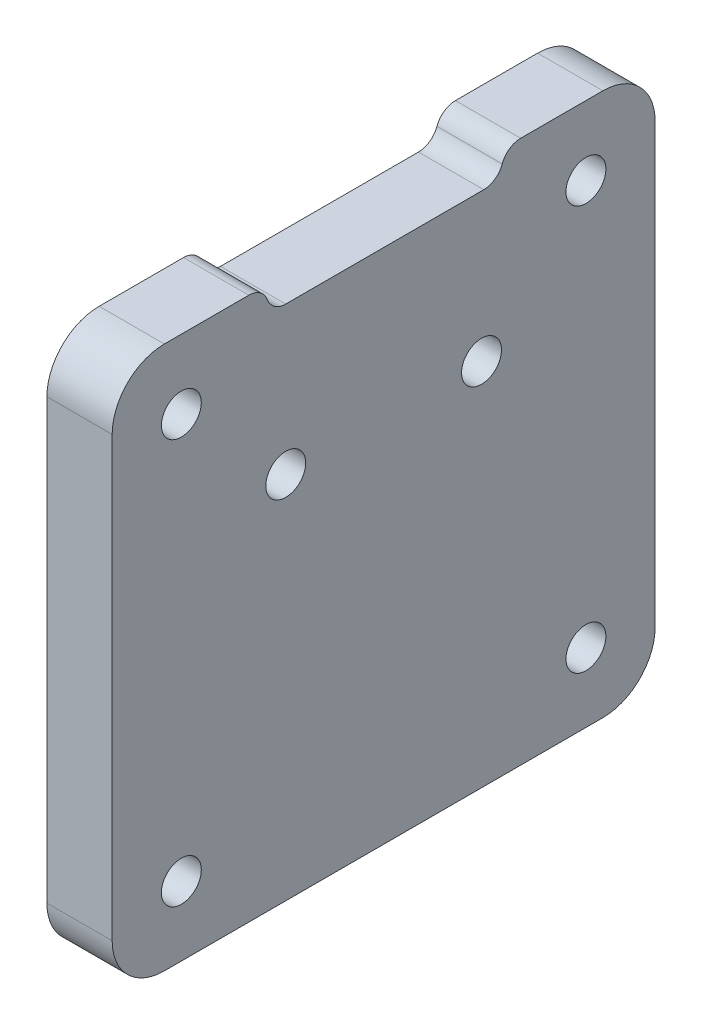
ISO-10303-21;
HEADER;
FILE_DESCRIPTION(('STEP AP214'),'2;1');
FILE_NAME('part.step','',(''),(''),'','','');
FILE_SCHEMA(('AUTOMOTIVE_DESIGN { 1 0 10303 214 1 1 1 1 }'));
ENDSEC;
DATA;
#1=APPLICATION_CONTEXT('core data for automotive mechanical design processes');
#2=APPLICATION_PROTOCOL_DEFINITION('international standard','automotive_design',2000,#1);
#3=PRODUCT_CONTEXT('',#1,'mechanical');
#4=PRODUCT('Part','Part','',(#3));
#5=PRODUCT_RELATED_PRODUCT_CATEGORY('part','',(#4));
#6=PRODUCT_DEFINITION_FORMATION('','',#4);
#7=PRODUCT_DEFINITION_CONTEXT('part definition',#1,'design');
#8=PRODUCT_DEFINITION('design','',#6,#7);
#9=PRODUCT_DEFINITION_SHAPE('','',#8);
#10=(LENGTH_UNIT() NAMED_UNIT(*) SI_UNIT(.MILLI.,.METRE.));
#11=(NAMED_UNIT(*) PLANE_ANGLE_UNIT() SI_UNIT($,.RADIAN.));
#12=(NAMED_UNIT(*) SI_UNIT($,.STERADIAN.) SOLID_ANGLE_UNIT());
#13=UNCERTAINTY_MEASURE_WITH_UNIT(LENGTH_MEASURE(1.E-05),#10,'distance_accuracy_value','');
#14=(GEOMETRIC_REPRESENTATION_CONTEXT(3) GLOBAL_UNCERTAINTY_ASSIGNED_CONTEXT((#13)) GLOBAL_UNIT_ASSIGNED_CONTEXT((#10,
#11,#12)) REPRESENTATION_CONTEXT('',''));
#15=CARTESIAN_POINT('',(0.,0.,0.));
#16=DIRECTION('',(0.,0.,1.));
#17=DIRECTION('',(1.,0.,0.));
#18=AXIS2_PLACEMENT_3D('',#15,#16,#17);
#19=CARTESIAN_POINT('',(5.,0.,0.));
#20=DIRECTION('',(1.,0.,0.));
#21=DIRECTION('',(0.,1.,0.));
#22=AXIS2_PLACEMENT_3D('',#19,#20,#21);
#23=PLANE('',#22);
#24=CARTESIAN_POINT('',(5.,7.5,7.5));
#25=DIRECTION('',(-1.,0.,0.));
#26=DIRECTION('',(0.,1.,0.));
#27=AXIS2_PLACEMENT_3D('',#24,#25,#26);
#28=CIRCLE('',#27,1.53);
#29=CARTESIAN_POINT('',(5.,5.97,7.5));
#30=VERTEX_POINT('',#29);
#31=EDGE_CURVE('E280',#30,#30,#28,.T.);
#32=ORIENTED_EDGE('',*,*,#31,.T.);
#33=EDGE_LOOP('',(#32));
#34=FACE_BOUND('',#33,.T.);
#35=CARTESIAN_POINT('',(5.,7.5,-7.5));
#36=DIRECTION('',(-1.,0.,0.));
#37=DIRECTION('',(0.,1.,0.));
#38=AXIS2_PLACEMENT_3D('',#35,#36,#37);
#39=CIRCLE('',#38,1.53);
#40=CARTESIAN_POINT('',(5.,5.97,-7.5));
#41=VERTEX_POINT('',#40);
#42=EDGE_CURVE('E279',#41,#41,#39,.T.);
#43=ORIENTED_EDGE('',*,*,#42,.T.);
#44=EDGE_LOOP('',(#43));
#45=FACE_BOUND('',#44,.T.);
#46=CARTESIAN_POINT('',(5.,15.5,-15.5));
#47=DIRECTION('',(-1.,0.,0.));
#48=DIRECTION('',(0.,1.,0.));
#49=AXIS2_PLACEMENT_3D('',#46,#47,#48);
#50=CIRCLE('',#49,1.53);
#51=CARTESIAN_POINT('',(5.,13.97,-15.5));
#52=VERTEX_POINT('',#51);
#53=EDGE_CURVE('E367',#52,#52,#50,.T.);
#54=ORIENTED_EDGE('',*,*,#53,.T.);
#55=EDGE_LOOP('',(#54));
#56=FACE_BOUND('',#55,.T.);
#57=CARTESIAN_POINT('',(5.,-15.5,-15.5));
#58=DIRECTION('',(-1.,0.,0.));
#59=DIRECTION('',(0.,1.,0.));
#60=AXIS2_PLACEMENT_3D('',#57,#58,#59);
#61=CIRCLE('',#60,1.53);
#62=CARTESIAN_POINT('',(5.,-17.03,-15.5));
#63=VERTEX_POINT('',#62);
#64=EDGE_CURVE('E334',#63,#63,#61,.T.);
#65=ORIENTED_EDGE('',*,*,#64,.T.);
#66=EDGE_LOOP('',(#65));
#67=FACE_BOUND('',#66,.T.);
#68=CARTESIAN_POINT('',(5.,15.5,15.5));
#69=DIRECTION('',(-1.,0.,0.));
#70=DIRECTION('',(0.,1.,0.));
#71=AXIS2_PLACEMENT_3D('',#68,#69,#70);
#72=CIRCLE('',#71,1.53);
#73=CARTESIAN_POINT('',(5.,13.97,15.5));
#74=VERTEX_POINT('',#73);
#75=EDGE_CURVE('E302',#74,#74,#72,.T.);
#76=ORIENTED_EDGE('',*,*,#75,.T.);
#77=EDGE_LOOP('',(#76));
#78=FACE_BOUND('',#77,.T.);
#79=CARTESIAN_POINT('',(5.,-15.5,15.5));
#80=DIRECTION('',(-1.,0.,0.));
#81=DIRECTION('',(0.,1.,0.));
#82=AXIS2_PLACEMENT_3D('',#79,#80,#81);
#83=CIRCLE('',#82,1.53);
#84=CARTESIAN_POINT('',(5.,-17.03,15.5));
#85=VERTEX_POINT('',#84);
#86=EDGE_CURVE('E39',#85,#85,#83,.T.);
#87=ORIENTED_EDGE('',*,*,#86,.T.);
#88=EDGE_LOOP('',(#87));
#89=FACE_BOUND('',#88,.T.);
#90=CARTESIAN_POINT('',(5.,16.8,-16.8));
#91=DIRECTION('',(-1.,0.,0.));
#92=DIRECTION('',(0.,0.707106781186548,-0.707106781186548));
#93=AXIS2_PLACEMENT_3D('',#90,#91,#92);
#94=CIRCLE('',#93,4.);
#95=CARTESIAN_POINT('',(5.,20.8,-16.8));
#96=VERTEX_POINT('',#95);
#97=CARTESIAN_POINT('',(5.,16.8,-20.8));
#98=VERTEX_POINT('',#97);
#99=EDGE_CURVE('E264',#96,#98,#94,.T.);
#100=ORIENTED_EDGE('',*,*,#99,.F.);
#101=DIRECTION('',(0.,0.,1.));
#102=VECTOR('',#101,1.);
#103=CARTESIAN_POINT('',(5.,20.8,-20.8));
#104=LINE('',#103,#102);
#105=CARTESIAN_POINT('',(5.,20.8,-10.5));
#106=VERTEX_POINT('',#105);
#107=EDGE_CURVE('E373',#96,#106,#104,.T.);
#108=ORIENTED_EDGE('',*,*,#107,.T.);
#109=CARTESIAN_POINT('',(5.,19.3,-10.5));
#110=DIRECTION('',(-1.,0.,0.));
#111=DIRECTION('',(0.,0.707106781186548,0.707106781186548));
#112=AXIS2_PLACEMENT_3D('',#109,#110,#111);
#113=CIRCLE('',#112,1.5);
#114=CARTESIAN_POINT('',(5.,19.8,-9.08578643762691));
#115=VERTEX_POINT('',#114);
#116=EDGE_CURVE('E271',#115,#106,#113,.T.);
#117=ORIENTED_EDGE('',*,*,#116,.F.);
#118=CARTESIAN_POINT('',(5.,20.3,-7.67157287525381));
#119=DIRECTION('',(1.,0.,0.));
#120=DIRECTION('',(0.,1.,0.));
#121=AXIS2_PLACEMENT_3D('',#118,#119,#120);
#122=CIRCLE('',#121,1.5);
#123=CARTESIAN_POINT('',(5.,18.8,-7.67157287525381));
#124=VERTEX_POINT('',#123);
#125=EDGE_CURVE('E436',#124,#115,#122,.T.);
#126=ORIENTED_EDGE('',*,*,#125,.F.);
#127=DIRECTION('',(0.,0.,1.));
#128=VECTOR('',#127,1.);
#129=CARTESIAN_POINT('',(5.,18.8,9.));
#130=LINE('',#129,#128);
#131=CARTESIAN_POINT('',(5.,18.8,7.5));
#132=VERTEX_POINT('',#131);
#133=EDGE_CURVE('E173',#124,#132,#130,.T.);
#134=ORIENTED_EDGE('',*,*,#133,.T.);
#135=CARTESIAN_POINT('',(5.,20.3,7.5));
#136=DIRECTION('',(1.,0.,0.));
#137=DIRECTION('',(0.,-0.707106781186549,0.707106781186546));
#138=AXIS2_PLACEMENT_3D('',#135,#136,#137);
#139=CIRCLE('',#138,1.5);
#140=CARTESIAN_POINT('',(5.,19.8,8.91421356237309));
#141=VERTEX_POINT('',#140);
#142=EDGE_CURVE('E258',#141,#132,#139,.T.);
#143=ORIENTED_EDGE('',*,*,#142,.F.);
#144=CARTESIAN_POINT('',(5.,19.3,10.3284271247462));
#145=DIRECTION('',(-1.,0.,0.));
#146=DIRECTION('',(0.,-1.,0.));
#147=AXIS2_PLACEMENT_3D('',#144,#145,#146);
#148=CIRCLE('',#147,1.5);
#149=CARTESIAN_POINT('',(5.,20.8,10.3284271247462));
#150=VERTEX_POINT('',#149);
#151=EDGE_CURVE('E161',#150,#141,#148,.T.);
#152=ORIENTED_EDGE('',*,*,#151,.F.);
#153=DIRECTION('',(0.,0.,1.));
#154=VECTOR('',#153,1.);
#155=CARTESIAN_POINT('',(5.,20.8,9.));
#156=LINE('',#155,#154);
#157=CARTESIAN_POINT('',(5.,20.8,16.8));
#158=VERTEX_POINT('',#157);
#159=EDGE_CURVE('E154',#150,#158,#156,.T.);
#160=ORIENTED_EDGE('',*,*,#159,.T.);
#161=CARTESIAN_POINT('',(5.,16.8,16.8));
#162=DIRECTION('',(-1.,0.,0.));
#163=DIRECTION('',(0.,0.707106781186548,0.707106781186548));
#164=AXIS2_PLACEMENT_3D('',#161,#162,#163);
#165=CIRCLE('',#164,4.);
#166=CARTESIAN_POINT('',(5.,16.8,20.8));
#167=VERTEX_POINT('',#166);
#168=EDGE_CURVE('E316',#167,#158,#165,.T.);
#169=ORIENTED_EDGE('',*,*,#168,.F.);
#170=DIRECTION('',(0.,-1.,0.));
#171=VECTOR('',#170,1.);
#172=CARTESIAN_POINT('',(5.,20.8,20.8));
#173=LINE('',#172,#171);
#174=CARTESIAN_POINT('',(5.,-16.8,20.8));
#175=VERTEX_POINT('',#174);
#176=EDGE_CURVE('E11',#167,#175,#173,.T.);
#177=ORIENTED_EDGE('',*,*,#176,.T.);
#178=CARTESIAN_POINT('',(5.,-16.8,16.8));
#179=DIRECTION('',(-1.,0.,0.));
#180=DIRECTION('',(0.,-0.707106781186547,0.707106781186548));
#181=AXIS2_PLACEMENT_3D('',#178,#179,#180);
#182=CIRCLE('',#181,4.);
#183=CARTESIAN_POINT('',(5.,-20.8,16.8));
#184=VERTEX_POINT('',#183);
#185=EDGE_CURVE('E215',#184,#175,#182,.T.);
#186=ORIENTED_EDGE('',*,*,#185,.F.);
#187=DIRECTION('',(0.,0.,-1.));
#188=VECTOR('',#187,1.);
#189=CARTESIAN_POINT('',(5.,-20.8,20.8));
#190=LINE('',#189,#188);
#191=CARTESIAN_POINT('',(5.,-20.8,-16.8));
#192=VERTEX_POINT('',#191);
#193=EDGE_CURVE('E220',#184,#192,#190,.T.);
#194=ORIENTED_EDGE('',*,*,#193,.T.);
#195=CARTESIAN_POINT('',(5.,-16.8,-16.8));
#196=DIRECTION('',(-1.,0.,0.));
#197=DIRECTION('',(0.,-0.707106781186548,-0.707106781186547));
#198=AXIS2_PLACEMENT_3D('',#195,#196,#197);
#199=CIRCLE('',#198,4.);
#200=CARTESIAN_POINT('',(5.,-16.8,-20.8));
#201=VERTEX_POINT('',#200);
#202=EDGE_CURVE('E391',#201,#192,#199,.T.);
#203=ORIENTED_EDGE('',*,*,#202,.F.);
#204=DIRECTION('',(0.,1.,0.));
#205=VECTOR('',#204,1.);
#206=CARTESIAN_POINT('',(5.,-20.8,-20.8));
#207=LINE('',#206,#205);
#208=EDGE_CURVE('E27',#201,#98,#207,.T.);
#209=ORIENTED_EDGE('',*,*,#208,.T.);
#210=EDGE_LOOP('',(#100,#108,#117,#126,#134,#143,#152,#160,#169,#177,#186,#194,#203,#209));
#211=FACE_BOUND('',#210,.T.);
#212=ADVANCED_FACE('F16',(#34,#45,#56,#67,#78,#89,#211),#23,.T.);
#213=CARTESIAN_POINT('',(0.,20.8,20.8));
#214=DIRECTION('',(0.,0.,1.));
#215=DIRECTION('',(1.,0.,0.));
#216=AXIS2_PLACEMENT_3D('',#213,#214,#215);
#217=PLANE('',#216);
#218=DIRECTION('',(-1.,0.,0.));
#219=VECTOR('',#218,1.);
#220=CARTESIAN_POINT('',(0.,-16.8,20.8));
#221=LINE('',#220,#219);
#222=CARTESIAN_POINT('',(0.,-16.8,20.8));
#223=VERTEX_POINT('',#222);
#224=EDGE_CURVE('E225',#175,#223,#221,.T.);
#225=ORIENTED_EDGE('',*,*,#224,.F.);
#226=ORIENTED_EDGE('',*,*,#176,.F.);
#227=DIRECTION('',(1.,0.,0.));
#228=VECTOR('',#227,1.);
#229=CARTESIAN_POINT('',(0.,16.8,20.8));
#230=LINE('',#229,#228);
#231=CARTESIAN_POINT('',(0.,16.8,20.8));
#232=VERTEX_POINT('',#231);
#233=EDGE_CURVE('E315',#232,#167,#230,.T.);
#234=ORIENTED_EDGE('',*,*,#233,.F.);
#235=DIRECTION('',(0.,-1.,0.));
#236=VECTOR('',#235,1.);
#237=CARTESIAN_POINT('',(0.,20.8,20.8));
#238=LINE('',#237,#236);
#239=EDGE_CURVE('E286',#232,#223,#238,.T.);
#240=ORIENTED_EDGE('',*,*,#239,.T.);
#241=EDGE_LOOP('',(#225,#226,#234,#240));
#242=FACE_BOUND('',#241,.T.);
#243=ADVANCED_FACE('F544',(#242),#217,.T.);
#244=CARTESIAN_POINT('',(0.,-20.8,-20.8));
#245=DIRECTION('',(0.,0.,-1.));
#246=DIRECTION('',(0.,-1.,0.));
#247=AXIS2_PLACEMENT_3D('',#244,#245,#246);
#248=PLANE('',#247);
#249=DIRECTION('',(-1.,0.,0.));
#250=VECTOR('',#249,1.);
#251=CARTESIAN_POINT('',(0.,16.8,-20.8));
#252=LINE('',#251,#250);
#253=CARTESIAN_POINT('',(0.,16.8,-20.8));
#254=VERTEX_POINT('',#253);
#255=EDGE_CURVE('E259',#98,#254,#252,.T.);
#256=ORIENTED_EDGE('',*,*,#255,.F.);
#257=ORIENTED_EDGE('',*,*,#208,.F.);
#258=DIRECTION('',(1.,0.,0.));
#259=VECTOR('',#258,1.);
#260=CARTESIAN_POINT('',(0.,-16.8,-20.8));
#261=LINE('',#260,#259);
#262=CARTESIAN_POINT('',(0.,-16.8,-20.8));
#263=VERTEX_POINT('',#262);
#264=EDGE_CURVE('E241',#263,#201,#261,.T.);
#265=ORIENTED_EDGE('',*,*,#264,.F.);
#266=DIRECTION('',(0.,1.,0.));
#267=VECTOR('',#266,1.);
#268=CARTESIAN_POINT('',(0.,-20.8,-20.8));
#269=LINE('',#268,#267);
#270=EDGE_CURVE('E377',#263,#254,#269,.T.);
#271=ORIENTED_EDGE('',*,*,#270,.T.);
#272=EDGE_LOOP('',(#256,#257,#265,#271));
#273=FACE_BOUND('',#272,.T.);
#274=ADVANCED_FACE('F501',(#273),#248,.T.);
#275=CARTESIAN_POINT('',(0.,-15.5,15.5));
#276=DIRECTION('',(1.,0.,0.));
#277=DIRECTION('',(0.,1.,0.));
#278=AXIS2_PLACEMENT_3D('',#275,#276,#277);
#279=CYLINDRICAL_SURFACE('',#278,1.53);
#280=CARTESIAN_POINT('',(0.2,-15.5,15.5));
#281=DIRECTION('',(-1.,0.,0.));
#282=DIRECTION('',(0.,1.,0.));
#283=AXIS2_PLACEMENT_3D('',#280,#281,#282);
#284=CIRCLE('',#283,1.53);
#285=CARTESIAN_POINT('',(0.2,-17.03,15.5));
#286=VERTEX_POINT('',#285);
#287=EDGE_CURVE('E342',#286,#286,#284,.T.);
#288=ORIENTED_EDGE('',*,*,#287,.T.);
#289=DIRECTION('',(1.,0.,0.));
#290=VECTOR('',#289,1.);
#291=CARTESIAN_POINT('',(0.,-17.03,15.5));
#292=LINE('',#291,#290);
#293=EDGE_CURVE('E305',#286,#85,#292,.T.);
#294=ORIENTED_EDGE('',*,*,#293,.T.);
#295=ORIENTED_EDGE('',*,*,#86,.F.);
#296=ORIENTED_EDGE('',*,*,#293,.F.);
#297=EDGE_LOOP('',(#288,#294,#295,#296));
#298=FACE_BOUND('',#297,.T.);
#299=ADVANCED_FACE('F1038',(#298),#279,.F.);
#300=CARTESIAN_POINT('',(0.,15.5,15.5));
#301=DIRECTION('',(1.,0.,0.));
#302=DIRECTION('',(0.,1.,0.));
#303=AXIS2_PLACEMENT_3D('',#300,#301,#302);
#304=CYLINDRICAL_SURFACE('',#303,1.53);
#305=CARTESIAN_POINT('',(0.2,15.5,15.5));
#306=DIRECTION('',(-1.,0.,0.));
#307=DIRECTION('',(0.,1.,0.));
#308=AXIS2_PLACEMENT_3D('',#305,#306,#307);
#309=CIRCLE('',#308,1.53);
#310=CARTESIAN_POINT('',(0.2,13.97,15.5));
#311=VERTEX_POINT('',#310);
#312=EDGE_CURVE('E357',#311,#311,#309,.T.);
#313=ORIENTED_EDGE('',*,*,#312,.T.);
#314=DIRECTION('',(1.,0.,0.));
#315=VECTOR('',#314,1.);
#316=CARTESIAN_POINT('',(0.,13.97,15.5));
#317=LINE('',#316,#315);
#318=EDGE_CURVE('E306',#311,#74,#317,.T.);
#319=ORIENTED_EDGE('',*,*,#318,.T.);
#320=ORIENTED_EDGE('',*,*,#75,.F.);
#321=ORIENTED_EDGE('',*,*,#318,.F.);
#322=EDGE_LOOP('',(#313,#319,#320,#321));
#323=FACE_BOUND('',#322,.T.);
#324=ADVANCED_FACE('F551',(#323),#304,.F.);
#325=CARTESIAN_POINT('',(0.,-15.5,-15.5));
#326=DIRECTION('',(1.,0.,0.));
#327=DIRECTION('',(0.,1.,0.));
#328=AXIS2_PLACEMENT_3D('',#325,#326,#327);
#329=CYLINDRICAL_SURFACE('',#328,1.53);
#330=CARTESIAN_POINT('',(0.2,-15.5,-15.5));
#331=DIRECTION('',(-1.,0.,0.));
#332=DIRECTION('',(0.,1.,0.));
#333=AXIS2_PLACEMENT_3D('',#330,#331,#332);
#334=CIRCLE('',#333,1.53);
#335=CARTESIAN_POINT('',(0.2,-17.03,-15.5));
#336=VERTEX_POINT('',#335);
#337=EDGE_CURVE('E329',#336,#336,#334,.T.);
#338=ORIENTED_EDGE('',*,*,#337,.T.);
#339=DIRECTION('',(1.,0.,0.));
#340=VECTOR('',#339,1.);
#341=CARTESIAN_POINT('',(0.,-17.03,-15.5));
#342=LINE('',#341,#340);
#343=EDGE_CURVE('E371',#336,#63,#342,.T.);
#344=ORIENTED_EDGE('',*,*,#343,.T.);
#345=ORIENTED_EDGE('',*,*,#64,.F.);
#346=ORIENTED_EDGE('',*,*,#343,.F.);
#347=EDGE_LOOP('',(#338,#344,#345,#346));
#348=FACE_BOUND('',#347,.T.);
#349=ADVANCED_FACE('F1019',(#348),#329,.F.);
#350=CARTESIAN_POINT('',(0.,15.5,-15.5));
#351=DIRECTION('',(1.,0.,0.));
#352=DIRECTION('',(0.,1.,0.));
#353=AXIS2_PLACEMENT_3D('',#350,#351,#352);
#354=CYLINDRICAL_SURFACE('',#353,1.53);
#355=CARTESIAN_POINT('',(0.2,15.5,-15.5));
#356=DIRECTION('',(-1.,0.,0.));
#357=DIRECTION('',(0.,1.,0.));
#358=AXIS2_PLACEMENT_3D('',#355,#356,#357);
#359=CIRCLE('',#358,1.53);
#360=CARTESIAN_POINT('',(0.2,13.97,-15.5));
#361=VERTEX_POINT('',#360);
#362=EDGE_CURVE('E348',#361,#361,#359,.T.);
#363=ORIENTED_EDGE('',*,*,#362,.T.);
#364=DIRECTION('',(1.,0.,0.));
#365=VECTOR('',#364,1.);
#366=CARTESIAN_POINT('',(0.,13.97,-15.5));
#367=LINE('',#366,#365);
#368=EDGE_CURVE('E372',#361,#52,#367,.T.);
#369=ORIENTED_EDGE('',*,*,#368,.T.);
#370=ORIENTED_EDGE('',*,*,#53,.F.);
#371=ORIENTED_EDGE('',*,*,#368,.F.);
#372=EDGE_LOOP('',(#363,#369,#370,#371));
#373=FACE_BOUND('',#372,.T.);
#374=ADVANCED_FACE('F539',(#373),#354,.F.);
#375=CARTESIAN_POINT('',(0.,7.5,-7.5));
#376=DIRECTION('',(1.,0.,0.));
#377=DIRECTION('',(0.,1.,0.));
#378=AXIS2_PLACEMENT_3D('',#375,#376,#377);
#379=CYLINDRICAL_SURFACE('',#378,1.53);
#380=CARTESIAN_POINT('',(0.,7.5,-7.5));
#381=DIRECTION('',(-1.,0.,0.));
#382=DIRECTION('',(0.,1.,0.));
#383=AXIS2_PLACEMENT_3D('',#380,#381,#382);
#384=CIRCLE('',#383,1.53);
#385=CARTESIAN_POINT('',(0.,5.97,-7.5));
#386=VERTEX_POINT('',#385);
#387=EDGE_CURVE('E401',#386,#386,#384,.T.);
#388=ORIENTED_EDGE('',*,*,#387,.T.);
#389=DIRECTION('',(1.,0.,0.));
#390=VECTOR('',#389,1.);
#391=CARTESIAN_POINT('',(0.,5.97,-7.5));
#392=LINE('',#391,#390);
#393=EDGE_CURVE('E275',#386,#41,#392,.T.);
#394=ORIENTED_EDGE('',*,*,#393,.T.);
#395=ORIENTED_EDGE('',*,*,#42,.F.);
#396=ORIENTED_EDGE('',*,*,#393,.F.);
#397=EDGE_LOOP('',(#388,#394,#395,#396));
#398=FACE_BOUND('',#397,.T.);
#399=ADVANCED_FACE('F602',(#398),#379,.F.);
#400=CARTESIAN_POINT('',(0.,7.5,7.5));
#401=DIRECTION('',(1.,0.,0.));
#402=DIRECTION('',(0.,1.,0.));
#403=AXIS2_PLACEMENT_3D('',#400,#401,#402);
#404=CYLINDRICAL_SURFACE('',#403,1.53);
#405=CARTESIAN_POINT('',(0.,7.5,7.5));
#406=DIRECTION('',(-1.,0.,0.));
#407=DIRECTION('',(0.,1.,0.));
#408=AXIS2_PLACEMENT_3D('',#405,#406,#407);
#409=CIRCLE('',#408,1.53);
#410=CARTESIAN_POINT('',(0.,5.97,7.5));
#411=VERTEX_POINT('',#410);
#412=EDGE_CURVE('E394',#411,#411,#409,.T.);
#413=ORIENTED_EDGE('',*,*,#412,.T.);
#414=DIRECTION('',(1.,0.,0.));
#415=VECTOR('',#414,1.);
#416=CARTESIAN_POINT('',(0.,5.97,7.5));
#417=LINE('',#416,#415);
#418=EDGE_CURVE('E356',#411,#30,#417,.T.);
#419=ORIENTED_EDGE('',*,*,#418,.T.);
#420=ORIENTED_EDGE('',*,*,#31,.F.);
#421=ORIENTED_EDGE('',*,*,#418,.F.);
#422=EDGE_LOOP('',(#413,#419,#420,#421));
#423=FACE_BOUND('',#422,.T.);
#424=ADVANCED_FACE('F598',(#423),#404,.F.);
#425=CARTESIAN_POINT('',(0.2,-15.5,-15.5));
#426=DIRECTION('',(1.,0.,0.));
#427=DIRECTION('',(0.,1.,0.));
#428=AXIS2_PLACEMENT_3D('',#425,#426,#427);
#429=PLANE('',#428);
#430=ORIENTED_EDGE('',*,*,#337,.F.);
#431=EDGE_LOOP('',(#430));
#432=FACE_BOUND('',#431,.T.);
#433=CARTESIAN_POINT('',(0.2,-15.5,-15.5));
#434=DIRECTION('',(1.,0.,0.));
#435=DIRECTION('',(0.,-1.,0.));
#436=AXIS2_PLACEMENT_3D('',#433,#434,#435);
#437=CIRCLE('',#436,2.5);
#438=CARTESIAN_POINT('',(0.2,-13.,-15.5));
#439=VERTEX_POINT('',#438);
#440=EDGE_CURVE('E325',#439,#439,#437,.T.);
#441=ORIENTED_EDGE('',*,*,#440,.F.);
#442=EDGE_LOOP('',(#441));
#443=FACE_BOUND('',#442,.T.);
#444=ADVANCED_FACE('F601',(#432,#443),#429,.F.);
#445=CARTESIAN_POINT('',(0.1,-15.5,-15.5));
#446=DIRECTION('',(1.,0.,0.));
#447=DIRECTION('',(0.,-1.,0.));
#448=AXIS2_PLACEMENT_3D('',#445,#446,#447);
#449=CYLINDRICAL_SURFACE('',#448,2.5);
#450=CARTESIAN_POINT('',(0.,-15.5,-15.5));
#451=DIRECTION('',(1.,0.,0.));
#452=DIRECTION('',(0.,-1.,0.));
#453=AXIS2_PLACEMENT_3D('',#450,#451,#452);
#454=CIRCLE('',#453,2.5);
#455=CARTESIAN_POINT('',(0.,-13.,-15.5));
#456=VERTEX_POINT('',#455);
#457=EDGE_CURVE('E20',#456,#456,#454,.T.);
#458=ORIENTED_EDGE('',*,*,#457,.F.);
#459=DIRECTION('',(1.,0.,0.));
#460=VECTOR('',#459,1.);
#461=CARTESIAN_POINT('',(0.1,-13.,-15.5));
#462=LINE('',#461,#460);
#463=EDGE_CURVE('E330',#456,#439,#462,.T.);
#464=ORIENTED_EDGE('',*,*,#463,.T.);
#465=ORIENTED_EDGE('',*,*,#440,.T.);
#466=ORIENTED_EDGE('',*,*,#463,.F.);
#467=EDGE_LOOP('',(#458,#464,#465,#466));
#468=FACE_BOUND('',#467,.T.);
#469=ADVANCED_FACE('F558',(#468),#449,.F.);
#470=CARTESIAN_POINT('',(0.2,15.5,15.5));
#471=DIRECTION('',(1.,0.,0.));
#472=DIRECTION('',(0.,1.,0.));
#473=AXIS2_PLACEMENT_3D('',#470,#471,#472);
#474=PLANE('',#473);
#475=ORIENTED_EDGE('',*,*,#312,.F.);
#476=EDGE_LOOP('',(#475));
#477=FACE_BOUND('',#476,.T.);
#478=CARTESIAN_POINT('',(0.2,15.5,15.5));
#479=DIRECTION('',(1.,0.,0.));
#480=DIRECTION('',(0.,-1.,0.));
#481=AXIS2_PLACEMENT_3D('',#478,#479,#480);
#482=CIRCLE('',#481,2.5);
#483=CARTESIAN_POINT('',(0.2,18.,15.5));
#484=VERTEX_POINT('',#483);
#485=EDGE_CURVE('E341',#484,#484,#482,.T.);
#486=ORIENTED_EDGE('',*,*,#485,.F.);
#487=EDGE_LOOP('',(#486));
#488=FACE_BOUND('',#487,.T.);
#489=ADVANCED_FACE('F554',(#477,#488),#474,.F.);
#490=CARTESIAN_POINT('',(0.1,15.5,15.5));
#491=DIRECTION('',(1.,0.,0.));
#492=DIRECTION('',(0.,-1.,0.));
#493=AXIS2_PLACEMENT_3D('',#490,#491,#492);
#494=CYLINDRICAL_SURFACE('',#493,2.5);
#495=CARTESIAN_POINT('',(0.,15.5,15.5));
#496=DIRECTION('',(1.,0.,0.));
#497=DIRECTION('',(0.,-1.,0.));
#498=AXIS2_PLACEMENT_3D('',#495,#496,#497);
#499=CIRCLE('',#498,2.5);
#500=CARTESIAN_POINT('',(0.,18.,15.5));
#501=VERTEX_POINT('',#500);
#502=EDGE_CURVE('E269',#501,#501,#499,.T.);
#503=ORIENTED_EDGE('',*,*,#502,.F.);
#504=DIRECTION('',(1.,0.,0.));
#505=VECTOR('',#504,1.);
#506=CARTESIAN_POINT('',(0.1,18.,15.5));
#507=LINE('',#506,#505);
#508=EDGE_CURVE('E337',#501,#484,#507,.T.);
#509=ORIENTED_EDGE('',*,*,#508,.T.);
#510=ORIENTED_EDGE('',*,*,#485,.T.);
#511=ORIENTED_EDGE('',*,*,#508,.F.);
#512=EDGE_LOOP('',(#503,#509,#510,#511));
#513=FACE_BOUND('',#512,.T.);
#514=ADVANCED_FACE('F557',(#513),#494,.F.);
#515=CARTESIAN_POINT('',(0.2,-15.5,15.5));
#516=DIRECTION('',(1.,0.,0.));
#517=DIRECTION('',(0.,1.,0.));
#518=AXIS2_PLACEMENT_3D('',#515,#516,#517);
#519=PLANE('',#518);
#520=ORIENTED_EDGE('',*,*,#287,.F.);
#521=EDGE_LOOP('',(#520));
#522=FACE_BOUND('',#521,.T.);
#523=CARTESIAN_POINT('',(0.2,-15.5,15.5));
#524=DIRECTION('',(1.,0.,0.));
#525=DIRECTION('',(0.,-1.,0.));
#526=AXIS2_PLACEMENT_3D('',#523,#524,#525);
#527=CIRCLE('',#526,2.5);
#528=CARTESIAN_POINT('',(0.2,-13.,15.5));
#529=VERTEX_POINT('',#528);
#530=EDGE_CURVE('E347',#529,#529,#527,.T.);
#531=ORIENTED_EDGE('',*,*,#530,.F.);
#532=EDGE_LOOP('',(#531));
#533=FACE_BOUND('',#532,.T.);
#534=ADVANCED_FACE('F586',(#522,#533),#519,.F.);
#535=CARTESIAN_POINT('',(0.1,-15.5,15.5));
#536=DIRECTION('',(1.,0.,0.));
#537=DIRECTION('',(0.,-1.,0.));
#538=AXIS2_PLACEMENT_3D('',#535,#536,#537);
#539=CYLINDRICAL_SURFACE('',#538,2.5);
#540=CARTESIAN_POINT('',(0.,-15.5,15.5));
#541=DIRECTION('',(1.,0.,0.));
#542=DIRECTION('',(0.,-1.,0.));
#543=AXIS2_PLACEMENT_3D('',#540,#541,#542);
#544=CIRCLE('',#543,2.5);
#545=CARTESIAN_POINT('',(0.,-13.,15.5));
#546=VERTEX_POINT('',#545);
#547=EDGE_CURVE('E265',#546,#546,#544,.T.);
#548=ORIENTED_EDGE('',*,*,#547,.F.);
#549=DIRECTION('',(1.,0.,0.));
#550=VECTOR('',#549,1.);
#551=CARTESIAN_POINT('',(0.1,-13.,15.5));
#552=LINE('',#551,#550);
#553=EDGE_CURVE('E343',#546,#529,#552,.T.);
#554=ORIENTED_EDGE('',*,*,#553,.T.);
#555=ORIENTED_EDGE('',*,*,#530,.T.);
#556=ORIENTED_EDGE('',*,*,#553,.F.);
#557=EDGE_LOOP('',(#548,#554,#555,#556));
#558=FACE_BOUND('',#557,.T.);
#559=ADVANCED_FACE('F577',(#558),#539,.F.);
#560=CARTESIAN_POINT('',(0.2,15.5,-15.5));
#561=DIRECTION('',(1.,0.,0.));
#562=DIRECTION('',(0.,1.,0.));
#563=AXIS2_PLACEMENT_3D('',#560,#561,#562);
#564=PLANE('',#563);
#565=ORIENTED_EDGE('',*,*,#362,.F.);
#566=EDGE_LOOP('',(#565));
#567=FACE_BOUND('',#566,.T.);
#568=CARTESIAN_POINT('',(0.2,15.5,-15.5));
#569=DIRECTION('',(1.,0.,0.));
#570=DIRECTION('',(0.,-1.,0.));
#571=AXIS2_PLACEMENT_3D('',#568,#569,#570);
#572=CIRCLE('',#571,2.5);
#573=CARTESIAN_POINT('',(0.2,18.,-15.5));
#574=VERTEX_POINT('',#573);
#575=EDGE_CURVE('E257',#574,#574,#572,.T.);
#576=ORIENTED_EDGE('',*,*,#575,.F.);
#577=EDGE_LOOP('',(#576));
#578=FACE_BOUND('',#577,.T.);
#579=ADVANCED_FACE('F575',(#567,#578),#564,.F.);
#580=CARTESIAN_POINT('',(0.1,15.5,-15.5));
#581=DIRECTION('',(1.,0.,0.));
#582=DIRECTION('',(0.,-1.,0.));
#583=AXIS2_PLACEMENT_3D('',#580,#581,#582);
#584=CYLINDRICAL_SURFACE('',#583,2.5);
#585=CARTESIAN_POINT('',(0.,15.5,-15.5));
#586=DIRECTION('',(1.,0.,0.));
#587=DIRECTION('',(0.,-1.,0.));
#588=AXIS2_PLACEMENT_3D('',#585,#586,#587);
#589=CIRCLE('',#588,2.5);
#590=CARTESIAN_POINT('',(0.,18.,-15.5));
#591=VERTEX_POINT('',#590);
#592=EDGE_CURVE('E270',#591,#591,#589,.T.);
#593=ORIENTED_EDGE('',*,*,#592,.F.);
#594=DIRECTION('',(1.,0.,0.));
#595=VECTOR('',#594,1.);
#596=CARTESIAN_POINT('',(0.1,18.,-15.5));
#597=LINE('',#596,#595);
#598=EDGE_CURVE('E253',#591,#574,#597,.T.);
#599=ORIENTED_EDGE('',*,*,#598,.T.);
#600=ORIENTED_EDGE('',*,*,#575,.T.);
#601=ORIENTED_EDGE('',*,*,#598,.F.);
#602=EDGE_LOOP('',(#593,#599,#600,#601));
#603=FACE_BOUND('',#602,.T.);
#604=ADVANCED_FACE('F572',(#603),#584,.F.);
#605=CARTESIAN_POINT('',(0.,20.3,7.5));
#606=DIRECTION('',(1.,0.,0.));
#607=DIRECTION('',(0.,-0.707106781186549,0.707106781186546));
#608=AXIS2_PLACEMENT_3D('',#605,#606,#607);
#609=CYLINDRICAL_SURFACE('',#608,1.5);
#610=DIRECTION('',(-1.,0.,0.));
#611=VECTOR('',#610,1.);
#612=CARTESIAN_POINT('',(0.,19.8,8.91421356237309));
#613=LINE('',#612,#611);
#614=CARTESIAN_POINT('',(0.,19.8,8.91421356237309));
#615=VERTEX_POINT('',#614);
#616=EDGE_CURVE('E274',#141,#615,#613,.T.);
#617=ORIENTED_EDGE('',*,*,#616,.F.);
#618=ORIENTED_EDGE('',*,*,#142,.T.);
#619=DIRECTION('',(-1.,0.,0.));
#620=VECTOR('',#619,1.);
#621=CARTESIAN_POINT('',(0.,18.8,7.5));
#622=LINE('',#621,#620);
#623=CARTESIAN_POINT('',(0.,18.8,7.5));
#624=VERTEX_POINT('',#623);
#625=EDGE_CURVE('E300',#132,#624,#622,.T.);
#626=ORIENTED_EDGE('',*,*,#625,.T.);
#627=CARTESIAN_POINT('',(0.,20.3,7.5));
#628=DIRECTION('',(-1.,0.,0.));
#629=DIRECTION('',(0.,-0.707106781186549,0.707106781186546));
#630=AXIS2_PLACEMENT_3D('',#627,#628,#629);
#631=CIRCLE('',#630,1.5);
#632=EDGE_CURVE('E311',#624,#615,#631,.T.);
#633=ORIENTED_EDGE('',*,*,#632,.T.);
#634=EDGE_LOOP('',(#617,#618,#626,#633));
#635=FACE_BOUND('',#634,.T.);
#636=ADVANCED_FACE('F18',(#635),#609,.F.);
#637=CARTESIAN_POINT('',(0.,19.3,-10.5));
#638=DIRECTION('',(1.,0.,0.));
#639=DIRECTION('',(0.,0.707106781186548,0.707106781186548));
#640=AXIS2_PLACEMENT_3D('',#637,#638,#639);
#641=CYLINDRICAL_SURFACE('',#640,1.5);
#642=DIRECTION('',(-1.,0.,0.));
#643=VECTOR('',#642,1.);
#644=CARTESIAN_POINT('',(0.,19.8,-9.08578643762691));
#645=LINE('',#644,#643);
#646=CARTESIAN_POINT('',(0.,19.8,-9.08578643762691));
#647=VERTEX_POINT('',#646);
#648=EDGE_CURVE('E301',#115,#647,#645,.T.);
#649=ORIENTED_EDGE('',*,*,#648,.F.);
#650=ORIENTED_EDGE('',*,*,#116,.T.);
#651=DIRECTION('',(-1.,0.,0.));
#652=VECTOR('',#651,1.);
#653=CARTESIAN_POINT('',(0.,20.8,-10.5));
#654=LINE('',#653,#652);
#655=CARTESIAN_POINT('',(0.,20.8,-10.5));
#656=VERTEX_POINT('',#655);
#657=EDGE_CURVE('E251',#106,#656,#654,.T.);
#658=ORIENTED_EDGE('',*,*,#657,.T.);
#659=CARTESIAN_POINT('',(0.,19.3,-10.5));
#660=DIRECTION('',(1.,0.,0.));
#661=DIRECTION('',(0.,0.707106781186548,0.707106781186548));
#662=AXIS2_PLACEMENT_3D('',#659,#660,#661);
#663=CIRCLE('',#662,1.5);
#664=EDGE_CURVE('E320',#656,#647,#663,.T.);
#665=ORIENTED_EDGE('',*,*,#664,.T.);
#666=EDGE_LOOP('',(#649,#650,#658,#665));
#667=FACE_BOUND('',#666,.T.);
#668=ADVANCED_FACE('F494',(#667),#641,.T.);
#669=CARTESIAN_POINT('',(0.,19.3,10.3284271247462));
#670=DIRECTION('',(-1.,0.,0.));
#671=DIRECTION('',(0.,-1.,0.));
#672=AXIS2_PLACEMENT_3D('',#669,#670,#671);
#673=CYLINDRICAL_SURFACE('',#672,1.5);
#674=ORIENTED_EDGE('',*,*,#151,.T.);
#675=ORIENTED_EDGE('',*,*,#616,.T.);
#676=CARTESIAN_POINT('',(0.,19.3,10.3284271247462));
#677=DIRECTION('',(1.,0.,0.));
#678=DIRECTION('',(0.,-1.,0.));
#679=AXIS2_PLACEMENT_3D('',#676,#677,#678);
#680=CIRCLE('',#679,1.5);
#681=CARTESIAN_POINT('',(0.,20.8,10.3284271247462));
#682=VERTEX_POINT('',#681);
#683=EDGE_CURVE('E307',#615,#682,#680,.T.);
#684=ORIENTED_EDGE('',*,*,#683,.T.);
#685=DIRECTION('',(1.,0.,0.));
#686=VECTOR('',#685,1.);
#687=CARTESIAN_POINT('',(0.,20.8,10.3284271247462));
#688=LINE('',#687,#686);
#689=EDGE_CURVE('E418',#682,#150,#688,.T.);
#690=ORIENTED_EDGE('',*,*,#689,.T.);
#691=EDGE_LOOP('',(#674,#675,#684,#690));
#692=FACE_BOUND('',#691,.T.);
#693=ADVANCED_FACE('F592',(#692),#673,.T.);
#694=CARTESIAN_POINT('',(0.,18.8,-9.));
#695=DIRECTION('',(0.,1.,0.));
#696=DIRECTION('',(1.,0.,0.));
#697=AXIS2_PLACEMENT_3D('',#694,#695,#696);
#698=PLANE('',#697);
#699=DIRECTION('',(1.,0.,0.));
#700=VECTOR('',#699,1.);
#701=CARTESIAN_POINT('',(0.,18.8,-7.67157287525381));
#702=LINE('',#701,#700);
#703=CARTESIAN_POINT('',(0.,18.8,-7.67157287525381));
#704=VERTEX_POINT('',#703);
#705=EDGE_CURVE('E297',#704,#124,#702,.T.);
#706=ORIENTED_EDGE('',*,*,#705,.F.);
#707=DIRECTION('',(0.,0.,-1.));
#708=VECTOR('',#707,1.);
#709=CARTESIAN_POINT('',(0.,18.8,9.));
#710=LINE('',#709,#708);
#711=EDGE_CURVE('E381',#624,#704,#710,.T.);
#712=ORIENTED_EDGE('',*,*,#711,.F.);
#713=ORIENTED_EDGE('',*,*,#625,.F.);
#714=ORIENTED_EDGE('',*,*,#133,.F.);
#715=EDGE_LOOP('',(#706,#712,#713,#714));
#716=FACE_BOUND('',#715,.T.);
#717=ADVANCED_FACE('F511',(#716),#698,.T.);
#718=CARTESIAN_POINT('',(0.,20.3,-7.67157287525381));
#719=DIRECTION('',(1.,0.,0.));
#720=DIRECTION('',(0.,1.,0.));
#721=AXIS2_PLACEMENT_3D('',#718,#719,#720);
#722=CYLINDRICAL_SURFACE('',#721,1.5);
#723=ORIENTED_EDGE('',*,*,#125,.T.);
#724=ORIENTED_EDGE('',*,*,#648,.T.);
#725=CARTESIAN_POINT('',(0.,20.3,-7.67157287525381));
#726=DIRECTION('',(1.,0.,0.));
#727=DIRECTION('',(0.,1.,0.));
#728=AXIS2_PLACEMENT_3D('',#725,#726,#727);
#729=CIRCLE('',#728,1.5);
#730=EDGE_CURVE('E324',#704,#647,#729,.T.);
#731=ORIENTED_EDGE('',*,*,#730,.F.);
#732=ORIENTED_EDGE('',*,*,#705,.T.);
#733=EDGE_LOOP('',(#723,#724,#731,#732));
#734=FACE_BOUND('',#733,.T.);
#735=ADVANCED_FACE('F509',(#734),#722,.F.);
#736=CARTESIAN_POINT('',(0.,20.8,9.));
#737=DIRECTION('',(0.,1.,0.));
#738=DIRECTION('',(1.,0.,0.));
#739=AXIS2_PLACEMENT_3D('',#736,#737,#738);
#740=PLANE('',#739);
#741=DIRECTION('',(-1.,0.,0.));
#742=VECTOR('',#741,1.);
#743=CARTESIAN_POINT('',(0.,20.8,16.8));
#744=LINE('',#743,#742);
#745=CARTESIAN_POINT('',(0.,20.8,16.8));
#746=VERTEX_POINT('',#745);
#747=EDGE_CURVE('E312',#158,#746,#744,.T.);
#748=ORIENTED_EDGE('',*,*,#747,.F.);
#749=ORIENTED_EDGE('',*,*,#159,.F.);
#750=ORIENTED_EDGE('',*,*,#689,.F.);
#751=DIRECTION('',(0.,0.,1.));
#752=VECTOR('',#751,1.);
#753=CARTESIAN_POINT('',(0.,20.8,9.));
#754=LINE('',#753,#752);
#755=EDGE_CURVE('E285',#682,#746,#754,.T.);
#756=ORIENTED_EDGE('',*,*,#755,.T.);
#757=EDGE_LOOP('',(#748,#749,#750,#756));
#758=FACE_BOUND('',#757,.T.);
#759=ADVANCED_FACE('F607',(#758),#740,.T.);
#760=CARTESIAN_POINT('',(0.,16.8,16.8));
#761=DIRECTION('',(1.,0.,0.));
#762=DIRECTION('',(0.,0.707106781186548,0.707106781186548));
#763=AXIS2_PLACEMENT_3D('',#760,#761,#762);
#764=CYLINDRICAL_SURFACE('',#763,4.);
#765=ORIENTED_EDGE('',*,*,#168,.T.);
#766=ORIENTED_EDGE('',*,*,#747,.T.);
#767=CARTESIAN_POINT('',(0.,16.8,16.8));
#768=DIRECTION('',(1.,0.,0.));
#769=DIRECTION('',(0.,0.707106781186548,0.707106781186548));
#770=AXIS2_PLACEMENT_3D('',#767,#768,#769);
#771=CIRCLE('',#770,4.);
#772=EDGE_CURVE('E281',#746,#232,#771,.T.);
#773=ORIENTED_EDGE('',*,*,#772,.T.);
#774=ORIENTED_EDGE('',*,*,#233,.T.);
#775=EDGE_LOOP('',(#765,#766,#773,#774));
#776=FACE_BOUND('',#775,.T.);
#777=ADVANCED_FACE('F609',(#776),#764,.T.);
#778=CARTESIAN_POINT('',(0.,-16.8,16.8));
#779=DIRECTION('',(1.,0.,0.));
#780=DIRECTION('',(0.,-0.707106781186547,0.707106781186548));
#781=AXIS2_PLACEMENT_3D('',#778,#779,#780);
#782=CYLINDRICAL_SURFACE('',#781,4.);
#783=ORIENTED_EDGE('',*,*,#185,.T.);
#784=ORIENTED_EDGE('',*,*,#224,.T.);
#785=CARTESIAN_POINT('',(0.,-16.8,16.8));
#786=DIRECTION('',(1.,0.,0.));
#787=DIRECTION('',(0.,-0.707106781186547,0.707106781186548));
#788=AXIS2_PLACEMENT_3D('',#785,#786,#787);
#789=CIRCLE('',#788,4.);
#790=CARTESIAN_POINT('',(0.,-20.8,16.8));
#791=VERTEX_POINT('',#790);
#792=EDGE_CURVE('E231',#223,#791,#789,.T.);
#793=ORIENTED_EDGE('',*,*,#792,.T.);
#794=DIRECTION('',(1.,0.,0.));
#795=VECTOR('',#794,1.);
#796=CARTESIAN_POINT('',(0.,-20.8,16.8));
#797=LINE('',#796,#795);
#798=EDGE_CURVE('E226',#791,#184,#797,.T.);
#799=ORIENTED_EDGE('',*,*,#798,.T.);
#800=EDGE_LOOP('',(#783,#784,#793,#799));
#801=FACE_BOUND('',#800,.T.);
#802=ADVANCED_FACE('F229',(#801),#782,.T.);
#803=CARTESIAN_POINT('',(0.,-20.8,20.8));
#804=DIRECTION('',(0.,-1.,0.));
#805=DIRECTION('',(-1.,0.,0.));
#806=AXIS2_PLACEMENT_3D('',#803,#804,#805);
#807=PLANE('',#806);
#808=DIRECTION('',(-1.,0.,0.));
#809=VECTOR('',#808,1.);
#810=CARTESIAN_POINT('',(0.,-20.8,-16.8));
#811=LINE('',#810,#809);
#812=CARTESIAN_POINT('',(0.,-20.8,-16.8));
#813=VERTEX_POINT('',#812);
#814=EDGE_CURVE('E238',#192,#813,#811,.T.);
#815=ORIENTED_EDGE('',*,*,#814,.F.);
#816=ORIENTED_EDGE('',*,*,#193,.F.);
#817=ORIENTED_EDGE('',*,*,#798,.F.);
#818=DIRECTION('',(0.,0.,-1.));
#819=VECTOR('',#818,1.);
#820=CARTESIAN_POINT('',(0.,-20.8,20.8));
#821=LINE('',#820,#819);
#822=EDGE_CURVE('E366',#791,#813,#821,.T.);
#823=ORIENTED_EDGE('',*,*,#822,.T.);
#824=EDGE_LOOP('',(#815,#816,#817,#823));
#825=FACE_BOUND('',#824,.T.);
#826=ADVANCED_FACE('F237',(#825),#807,.T.);
#827=CARTESIAN_POINT('',(0.,-16.8,-16.8));
#828=DIRECTION('',(1.,0.,0.));
#829=DIRECTION('',(0.,-0.707106781186548,-0.707106781186547));
#830=AXIS2_PLACEMENT_3D('',#827,#828,#829);
#831=CYLINDRICAL_SURFACE('',#830,4.);
#832=ORIENTED_EDGE('',*,*,#202,.T.);
#833=ORIENTED_EDGE('',*,*,#814,.T.);
#834=CARTESIAN_POINT('',(0.,-16.8,-16.8));
#835=DIRECTION('',(1.,0.,0.));
#836=DIRECTION('',(0.,-0.707106781186548,-0.707106781186547));
#837=AXIS2_PLACEMENT_3D('',#834,#835,#836);
#838=CIRCLE('',#837,4.);
#839=EDGE_CURVE('E382',#813,#263,#838,.T.);
#840=ORIENTED_EDGE('',*,*,#839,.T.);
#841=ORIENTED_EDGE('',*,*,#264,.T.);
#842=EDGE_LOOP('',(#832,#833,#840,#841));
#843=FACE_BOUND('',#842,.T.);
#844=ADVANCED_FACE('F565',(#843),#831,.T.);
#845=CARTESIAN_POINT('',(0.,0.,0.));
#846=DIRECTION('',(1.,0.,0.));
#847=DIRECTION('',(0.,1.,0.));
#848=AXIS2_PLACEMENT_3D('',#845,#846,#847);
#849=PLANE('',#848);
#850=ORIENTED_EDGE('',*,*,#412,.F.);
#851=EDGE_LOOP('',(#850));
#852=FACE_BOUND('',#851,.T.);
#853=ORIENTED_EDGE('',*,*,#387,.F.);
#854=EDGE_LOOP('',(#853));
#855=FACE_BOUND('',#854,.T.);
#856=ORIENTED_EDGE('',*,*,#457,.T.);
#857=EDGE_LOOP('',(#856));
#858=FACE_BOUND('',#857,.T.);
#859=ORIENTED_EDGE('',*,*,#502,.T.);
#860=EDGE_LOOP('',(#859));
#861=FACE_BOUND('',#860,.T.);
#862=ORIENTED_EDGE('',*,*,#547,.T.);
#863=EDGE_LOOP('',(#862));
#864=FACE_BOUND('',#863,.T.);
#865=ORIENTED_EDGE('',*,*,#592,.T.);
#866=EDGE_LOOP('',(#865));
#867=FACE_BOUND('',#866,.T.);
#868=CARTESIAN_POINT('',(0.,16.8,-16.8));
#869=DIRECTION('',(1.,0.,0.));
#870=DIRECTION('',(0.,0.707106781186548,-0.707106781186548));
#871=AXIS2_PLACEMENT_3D('',#868,#869,#870);
#872=CIRCLE('',#871,4.);
#873=CARTESIAN_POINT('',(0.,20.8,-16.8));
#874=VERTEX_POINT('',#873);
#875=EDGE_CURVE('E263',#254,#874,#872,.T.);
#876=ORIENTED_EDGE('',*,*,#875,.F.);
#877=ORIENTED_EDGE('',*,*,#270,.F.);
#878=ORIENTED_EDGE('',*,*,#839,.F.);
#879=ORIENTED_EDGE('',*,*,#822,.F.);
#880=ORIENTED_EDGE('',*,*,#792,.F.);
#881=ORIENTED_EDGE('',*,*,#239,.F.);
#882=ORIENTED_EDGE('',*,*,#772,.F.);
#883=ORIENTED_EDGE('',*,*,#755,.F.);
#884=ORIENTED_EDGE('',*,*,#683,.F.);
#885=ORIENTED_EDGE('',*,*,#632,.F.);
#886=ORIENTED_EDGE('',*,*,#711,.T.);
#887=ORIENTED_EDGE('',*,*,#730,.T.);
#888=ORIENTED_EDGE('',*,*,#664,.F.);
#889=DIRECTION('',(0.,0.,1.));
#890=VECTOR('',#889,1.);
#891=CARTESIAN_POINT('',(0.,20.8,-20.8));
#892=LINE('',#891,#890);
#893=EDGE_CURVE('E296',#874,#656,#892,.T.);
#894=ORIENTED_EDGE('',*,*,#893,.F.);
#895=EDGE_LOOP('',(#876,#877,#878,#879,#880,#881,#882,#883,#884,#885,#886,#887,#888,#894));
#896=FACE_BOUND('',#895,.T.);
#897=ADVANCED_FACE('F505',(#852,#855,#858,#861,#864,#867,#896),#849,.F.);
#898=CARTESIAN_POINT('',(0.,20.8,-20.8));
#899=DIRECTION('',(0.,1.,0.));
#900=DIRECTION('',(1.,0.,0.));
#901=AXIS2_PLACEMENT_3D('',#898,#899,#900);
#902=PLANE('',#901);
#903=DIRECTION('',(1.,0.,0.));
#904=VECTOR('',#903,1.);
#905=CARTESIAN_POINT('',(0.,20.8,-16.8));
#906=LINE('',#905,#904);
#907=EDGE_CURVE('E290',#874,#96,#906,.T.);
#908=ORIENTED_EDGE('',*,*,#907,.F.);
#909=ORIENTED_EDGE('',*,*,#893,.T.);
#910=ORIENTED_EDGE('',*,*,#657,.F.);
#911=ORIENTED_EDGE('',*,*,#107,.F.);
#912=EDGE_LOOP('',(#908,#909,#910,#911));
#913=FACE_BOUND('',#912,.T.);
#914=ADVANCED_FACE('F495',(#913),#902,.T.);
#915=CARTESIAN_POINT('',(0.,16.8,-16.8));
#916=DIRECTION('',(1.,0.,0.));
#917=DIRECTION('',(0.,0.707106781186548,-0.707106781186548));
#918=AXIS2_PLACEMENT_3D('',#915,#916,#917);
#919=CYLINDRICAL_SURFACE('',#918,4.);
#920=ORIENTED_EDGE('',*,*,#99,.T.);
#921=ORIENTED_EDGE('',*,*,#255,.T.);
#922=ORIENTED_EDGE('',*,*,#875,.T.);
#923=ORIENTED_EDGE('',*,*,#907,.T.);
#924=EDGE_LOOP('',(#920,#921,#922,#923));
#925=FACE_BOUND('',#924,.T.);
#926=ADVANCED_FACE('F497',(#925),#919,.T.);
#927=CLOSED_SHELL('',(#212,#243,#274,#299,#324,#349,#374,#399,#424,#444,#469,#489,#514,#534,
#559,#579,#604,#636,#668,#693,#717,#735,#759,#777,#802,#826,#844,#897,#914,#926));
#928=MANIFOLD_SOLID_BREP('B1',#927);
#929=ADVANCED_BREP_SHAPE_REPRESENTATION('',(#18,#928),#14);
#930=SHAPE_DEFINITION_REPRESENTATION(#9,#929);
ENDSEC;
END-ISO-10303-21;
